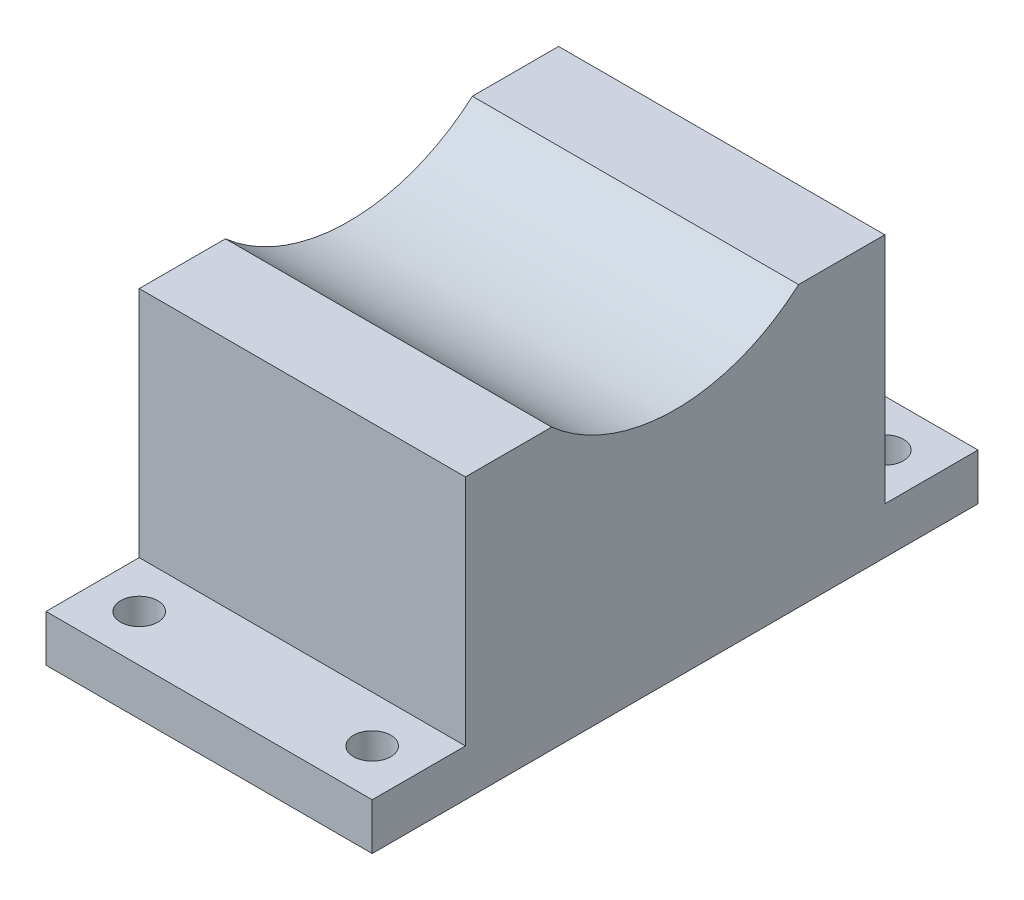
ISO-10303-21;
HEADER;
FILE_DESCRIPTION(('STEP AP214'),'2;1');
FILE_NAME('part.step','',(''),(''),'','','');
FILE_SCHEMA(('AUTOMOTIVE_DESIGN { 1 0 10303 214 1 1 1 1 }'));
ENDSEC;
DATA;
#1=APPLICATION_CONTEXT('core data for automotive mechanical design processes');
#2=APPLICATION_PROTOCOL_DEFINITION('international standard','automotive_design',2000,#1);
#3=PRODUCT_CONTEXT('',#1,'mechanical');
#4=PRODUCT('Part','Part','',(#3));
#5=PRODUCT_RELATED_PRODUCT_CATEGORY('part','',(#4));
#6=PRODUCT_DEFINITION_FORMATION('','',#4);
#7=PRODUCT_DEFINITION_CONTEXT('part definition',#1,'design');
#8=PRODUCT_DEFINITION('design','',#6,#7);
#9=PRODUCT_DEFINITION_SHAPE('','',#8);
#10=(LENGTH_UNIT() NAMED_UNIT(*) SI_UNIT(.MILLI.,.METRE.));
#11=(NAMED_UNIT(*) PLANE_ANGLE_UNIT() SI_UNIT($,.RADIAN.));
#12=(NAMED_UNIT(*) SI_UNIT($,.STERADIAN.) SOLID_ANGLE_UNIT());
#13=UNCERTAINTY_MEASURE_WITH_UNIT(LENGTH_MEASURE(1.E-05),#10,'distance_accuracy_value','');
#14=(GEOMETRIC_REPRESENTATION_CONTEXT(3) GLOBAL_UNCERTAINTY_ASSIGNED_CONTEXT((#13)) GLOBAL_UNIT_ASSIGNED_CONTEXT((#10,
#11,#12)) REPRESENTATION_CONTEXT('',''));
#15=CARTESIAN_POINT('',(0.,0.,0.));
#16=DIRECTION('',(0.,0.,1.));
#17=DIRECTION('',(1.,0.,0.));
#18=AXIS2_PLACEMENT_3D('',#15,#16,#17);
#19=CARTESIAN_POINT('',(35.,5.09934585254934,-1.30802110345688));
#20=DIRECTION('',(0.,1.,0.));
#21=DIRECTION('',(0.,0.,1.));
#22=AXIS2_PLACEMENT_3D('',#19,#20,#21);
#23=PLANE('',#22);
#24=DIRECTION('',(0.,0.,-1.));
#25=VECTOR('',#24,1.);
#26=CARTESIAN_POINT('',(0.,5.09934585254934,-1.30802110345688));
#27=LINE('',#26,#25);
#28=CARTESIAN_POINT('',(0.,5.09934585254934,-1.30802110345688));
#29=VERTEX_POINT('',#28);
#30=CARTESIAN_POINT('',(0.,5.09934585254934,-10.5607115959362));
#31=VERTEX_POINT('',#30);
#32=EDGE_CURVE('E145',#29,#31,#27,.T.);
#33=ORIENTED_EDGE('',*,*,#32,.F.);
#34=DIRECTION('',(-1.,0.,0.));
#35=VECTOR('',#34,1.);
#36=CARTESIAN_POINT('',(35.,5.09934585254934,-1.30802110345688));
#37=LINE('',#36,#35);
#38=CARTESIAN_POINT('',(35.,5.09934585254934,-1.30802110345688));
#39=VERTEX_POINT('',#38);
#40=EDGE_CURVE('E11',#39,#29,#37,.T.);
#41=ORIENTED_EDGE('',*,*,#40,.F.);
#42=DIRECTION('',(0.,0.,-1.));
#43=VECTOR('',#42,1.);
#44=CARTESIAN_POINT('',(35.,5.09934585254934,-1.30802110345688));
#45=LINE('',#44,#43);
#46=CARTESIAN_POINT('',(35.,5.09934585254934,-10.5607115959362));
#47=VERTEX_POINT('',#46);
#48=EDGE_CURVE('E169',#39,#47,#45,.T.);
#49=ORIENTED_EDGE('',*,*,#48,.T.);
#50=DIRECTION('',(-1.,0.,0.));
#51=VECTOR('',#50,1.);
#52=CARTESIAN_POINT('',(35.,5.09934585254934,-10.5607115959362));
#53=LINE('',#52,#51);
#54=EDGE_CURVE('E97',#47,#31,#53,.T.);
#55=ORIENTED_EDGE('',*,*,#54,.T.);
#56=EDGE_LOOP('',(#33,#41,#49,#55));
#57=FACE_BOUND('',#56,.T.);
#58=ADVANCED_FACE('F35',(#57),#23,.T.);
#59=CARTESIAN_POINT('',(35.,5.09934585254934,-1.30802110345688));
#60=DIRECTION('',(0.,0.,-1.));
#61=DIRECTION('',(0.,1.,0.));
#62=AXIS2_PLACEMENT_3D('',#59,#60,#61);
#63=PLANE('',#62);
#64=DIRECTION('',(0.,-1.,0.));
#65=VECTOR('',#64,1.);
#66=CARTESIAN_POINT('',(0.,5.09934585254934,-1.30802110345688));
#67=LINE('',#66,#65);
#68=CARTESIAN_POINT('',(0.,-19.9006541474507,-1.30802110345689));
#69=VERTEX_POINT('',#68);
#70=EDGE_CURVE('E168',#29,#69,#67,.T.);
#71=ORIENTED_EDGE('',*,*,#70,.T.);
#72=DIRECTION('',(-1.,0.,0.));
#73=VECTOR('',#72,1.);
#74=CARTESIAN_POINT('',(35.,-19.9006541474507,-1.30802110345689));
#75=LINE('',#74,#73);
#76=CARTESIAN_POINT('',(35.,-19.9006541474507,-1.30802110345689));
#77=VERTEX_POINT('',#76);
#78=EDGE_CURVE('E44',#77,#69,#75,.T.);
#79=ORIENTED_EDGE('',*,*,#78,.F.);
#80=DIRECTION('',(0.,-1.,0.));
#81=VECTOR('',#80,1.);
#82=CARTESIAN_POINT('',(35.,5.09934585254934,-1.30802110345688));
#83=LINE('',#82,#81);
#84=EDGE_CURVE('E134',#39,#77,#83,.T.);
#85=ORIENTED_EDGE('',*,*,#84,.F.);
#86=ORIENTED_EDGE('',*,*,#40,.T.);
#87=EDGE_LOOP('',(#71,#79,#85,#86));
#88=FACE_BOUND('',#87,.T.);
#89=ADVANCED_FACE('F238',(#88),#63,.F.);
#90=CARTESIAN_POINT('',(35.,-19.9006541474507,8.69197889654312));
#91=DIRECTION('',(0.,1.,0.));
#92=DIRECTION('',(0.,0.,1.));
#93=AXIS2_PLACEMENT_3D('',#90,#91,#92);
#94=PLANE('',#93);
#95=CARTESIAN_POINT('',(5.,-19.9006541474507,3.69197889654312));
#96=DIRECTION('',(0.,1.,0.));
#97=DIRECTION('',(0.,0.,1.));
#98=AXIS2_PLACEMENT_3D('',#95,#96,#97);
#99=CIRCLE('',#98,2.);
#100=CARTESIAN_POINT('',(5.,-19.9006541474507,5.69197889654312));
#101=VERTEX_POINT('',#100);
#102=EDGE_CURVE('E149',#101,#101,#99,.T.);
#103=ORIENTED_EDGE('',*,*,#102,.F.);
#104=EDGE_LOOP('',(#103));
#105=FACE_BOUND('',#104,.T.);
#106=CARTESIAN_POINT('',(30.,-19.9006541474507,3.69197889654312));
#107=DIRECTION('',(0.,1.,0.));
#108=DIRECTION('',(0.,0.,1.));
#109=AXIS2_PLACEMENT_3D('',#106,#107,#108);
#110=CIRCLE('',#109,2.);
#111=CARTESIAN_POINT('',(30.,-19.9006541474507,5.69197889654312));
#112=VERTEX_POINT('',#111);
#113=EDGE_CURVE('E191',#112,#112,#110,.T.);
#114=ORIENTED_EDGE('',*,*,#113,.F.);
#115=EDGE_LOOP('',(#114));
#116=FACE_BOUND('',#115,.T.);
#117=DIRECTION('',(0.,0.,-1.));
#118=VECTOR('',#117,1.);
#119=CARTESIAN_POINT('',(0.,-19.9006541474507,8.69197889654312));
#120=LINE('',#119,#118);
#121=CARTESIAN_POINT('',(0.,-19.9006541474507,8.69197889654312));
#122=VERTEX_POINT('',#121);
#123=EDGE_CURVE('E122',#122,#69,#120,.T.);
#124=ORIENTED_EDGE('',*,*,#123,.F.);
#125=DIRECTION('',(-1.,0.,0.));
#126=VECTOR('',#125,1.);
#127=CARTESIAN_POINT('',(35.,-19.9006541474507,8.69197889654312));
#128=LINE('',#127,#126);
#129=CARTESIAN_POINT('',(35.,-19.9006541474507,8.69197889654312));
#130=VERTEX_POINT('',#129);
#131=EDGE_CURVE('E117',#130,#122,#128,.T.);
#132=ORIENTED_EDGE('',*,*,#131,.F.);
#133=DIRECTION('',(0.,0.,-1.));
#134=VECTOR('',#133,1.);
#135=CARTESIAN_POINT('',(35.,-19.9006541474507,8.69197889654312));
#136=LINE('',#135,#134);
#137=EDGE_CURVE('E120',#130,#77,#136,.T.);
#138=ORIENTED_EDGE('',*,*,#137,.T.);
#139=ORIENTED_EDGE('',*,*,#78,.T.);
#140=EDGE_LOOP('',(#124,#132,#138,#139));
#141=FACE_BOUND('',#140,.T.);
#142=ADVANCED_FACE('F119',(#105,#116,#141),#94,.T.);
#143=CARTESIAN_POINT('',(35.,-24.9006541474507,8.69197889654312));
#144=DIRECTION('',(0.,0.,1.));
#145=DIRECTION('',(1.,0.,0.));
#146=AXIS2_PLACEMENT_3D('',#143,#144,#145);
#147=PLANE('',#146);
#148=DIRECTION('',(0.,1.,0.));
#149=VECTOR('',#148,1.);
#150=CARTESIAN_POINT('',(0.,-24.9006541474507,8.69197889654312));
#151=LINE('',#150,#149);
#152=CARTESIAN_POINT('',(0.,-24.9006541474507,8.69197889654312));
#153=VERTEX_POINT('',#152);
#154=EDGE_CURVE('E165',#153,#122,#151,.T.);
#155=ORIENTED_EDGE('',*,*,#154,.F.);
#156=DIRECTION('',(-1.,0.,0.));
#157=VECTOR('',#156,1.);
#158=CARTESIAN_POINT('',(35.,-24.9006541474507,8.69197889654312));
#159=LINE('',#158,#157);
#160=CARTESIAN_POINT('',(35.,-24.9006541474507,8.69197889654312));
#161=VERTEX_POINT('',#160);
#162=EDGE_CURVE('E127',#161,#153,#159,.T.);
#163=ORIENTED_EDGE('',*,*,#162,.F.);
#164=DIRECTION('',(0.,1.,0.));
#165=VECTOR('',#164,1.);
#166=CARTESIAN_POINT('',(35.,-24.9006541474507,8.69197889654312));
#167=LINE('',#166,#165);
#168=EDGE_CURVE('E133',#161,#130,#167,.T.);
#169=ORIENTED_EDGE('',*,*,#168,.T.);
#170=ORIENTED_EDGE('',*,*,#131,.T.);
#171=EDGE_LOOP('',(#155,#163,#169,#170));
#172=FACE_BOUND('',#171,.T.);
#173=ADVANCED_FACE('F136',(#172),#147,.T.);
#174=CARTESIAN_POINT('',(35.,-24.9006541474507,8.69197889654312));
#175=DIRECTION('',(0.,1.,0.));
#176=DIRECTION('',(0.,0.,1.));
#177=AXIS2_PLACEMENT_3D('',#174,#175,#176);
#178=PLANE('',#177);
#179=CARTESIAN_POINT('',(5.,-24.9006541474507,3.69197889654312));
#180=DIRECTION('',(0.,-1.,0.));
#181=DIRECTION('',(0.,0.,-1.));
#182=AXIS2_PLACEMENT_3D('',#179,#180,#181);
#183=CIRCLE('',#182,2.);
#184=CARTESIAN_POINT('',(5.,-24.9006541474507,1.69197889654312));
#185=VERTEX_POINT('',#184);
#186=EDGE_CURVE('E193',#185,#185,#183,.T.);
#187=ORIENTED_EDGE('',*,*,#186,.F.);
#188=EDGE_LOOP('',(#187));
#189=FACE_BOUND('',#188,.T.);
#190=CARTESIAN_POINT('',(30.,-24.9006541474507,-51.3080211034569));
#191=DIRECTION('',(0.,-1.,0.));
#192=DIRECTION('',(0.,0.,-1.));
#193=AXIS2_PLACEMENT_3D('',#190,#191,#192);
#194=CIRCLE('',#193,2.);
#195=CARTESIAN_POINT('',(30.,-24.9006541474507,-53.3080211034569));
#196=VERTEX_POINT('',#195);
#197=EDGE_CURVE('E198',#196,#196,#194,.T.);
#198=ORIENTED_EDGE('',*,*,#197,.F.);
#199=EDGE_LOOP('',(#198));
#200=FACE_BOUND('',#199,.T.);
#201=CARTESIAN_POINT('',(5.,-24.9006541474507,-51.3080211034569));
#202=DIRECTION('',(0.,-1.,0.));
#203=DIRECTION('',(0.,0.,-1.));
#204=AXIS2_PLACEMENT_3D('',#201,#202,#203);
#205=CIRCLE('',#204,2.);
#206=CARTESIAN_POINT('',(5.,-24.9006541474507,-53.3080211034569));
#207=VERTEX_POINT('',#206);
#208=EDGE_CURVE('E292',#207,#207,#205,.T.);
#209=ORIENTED_EDGE('',*,*,#208,.F.);
#210=EDGE_LOOP('',(#209));
#211=FACE_BOUND('',#210,.T.);
#212=CARTESIAN_POINT('',(30.,-24.9006541474507,3.69197889654312));
#213=DIRECTION('',(0.,-1.,0.));
#214=DIRECTION('',(0.,0.,-1.));
#215=AXIS2_PLACEMENT_3D('',#212,#213,#214);
#216=CIRCLE('',#215,2.);
#217=CARTESIAN_POINT('',(30.,-24.9006541474507,1.69197889654312));
#218=VERTEX_POINT('',#217);
#219=EDGE_CURVE('E187',#218,#218,#216,.T.);
#220=ORIENTED_EDGE('',*,*,#219,.F.);
#221=EDGE_LOOP('',(#220));
#222=FACE_BOUND('',#221,.T.);
#223=DIRECTION('',(0.,0.,-1.));
#224=VECTOR('',#223,1.);
#225=CARTESIAN_POINT('',(0.,-24.9006541474507,8.69197889654312));
#226=LINE('',#225,#224);
#227=CARTESIAN_POINT('',(0.,-24.9006541474507,-56.3080211034569));
#228=VERTEX_POINT('',#227);
#229=EDGE_CURVE('E163',#153,#228,#226,.T.);
#230=ORIENTED_EDGE('',*,*,#229,.T.);
#231=DIRECTION('',(-1.,0.,0.));
#232=VECTOR('',#231,1.);
#233=CARTESIAN_POINT('',(35.,-24.9006541474507,-56.3080211034569));
#234=LINE('',#233,#232);
#235=CARTESIAN_POINT('',(35.,-24.9006541474507,-56.3080211034569));
#236=VERTEX_POINT('',#235);
#237=EDGE_CURVE('E173',#236,#228,#234,.T.);
#238=ORIENTED_EDGE('',*,*,#237,.F.);
#239=DIRECTION('',(0.,0.,-1.));
#240=VECTOR('',#239,1.);
#241=CARTESIAN_POINT('',(35.,-24.9006541474507,8.69197889654312));
#242=LINE('',#241,#240);
#243=EDGE_CURVE('E138',#161,#236,#242,.T.);
#244=ORIENTED_EDGE('',*,*,#243,.F.);
#245=ORIENTED_EDGE('',*,*,#162,.T.);
#246=EDGE_LOOP('',(#230,#238,#244,#245));
#247=FACE_BOUND('',#246,.T.);
#248=ADVANCED_FACE('F252',(#189,#200,#211,#222,#247),#178,.F.);
#249=CARTESIAN_POINT('',(35.,-24.9006541474507,-56.3080211034569));
#250=DIRECTION('',(0.,0.,1.));
#251=DIRECTION('',(1.,0.,0.));
#252=AXIS2_PLACEMENT_3D('',#249,#250,#251);
#253=PLANE('',#252);
#254=DIRECTION('',(0.,1.,0.));
#255=VECTOR('',#254,1.);
#256=CARTESIAN_POINT('',(0.,-24.9006541474507,-56.3080211034569));
#257=LINE('',#256,#255);
#258=CARTESIAN_POINT('',(0.,-19.9006541474507,-56.3080211034569));
#259=VERTEX_POINT('',#258);
#260=EDGE_CURVE('E161',#228,#259,#257,.T.);
#261=ORIENTED_EDGE('',*,*,#260,.T.);
#262=DIRECTION('',(-1.,0.,0.));
#263=VECTOR('',#262,1.);
#264=CARTESIAN_POINT('',(35.,-19.9006541474507,-56.3080211034569));
#265=LINE('',#264,#263);
#266=CARTESIAN_POINT('',(35.,-19.9006541474507,-56.3080211034569));
#267=VERTEX_POINT('',#266);
#268=EDGE_CURVE('E176',#267,#259,#265,.T.);
#269=ORIENTED_EDGE('',*,*,#268,.F.);
#270=DIRECTION('',(0.,1.,0.));
#271=VECTOR('',#270,1.);
#272=CARTESIAN_POINT('',(35.,-24.9006541474507,-56.3080211034569));
#273=LINE('',#272,#271);
#274=EDGE_CURVE('E140',#236,#267,#273,.T.);
#275=ORIENTED_EDGE('',*,*,#274,.F.);
#276=ORIENTED_EDGE('',*,*,#237,.T.);
#277=EDGE_LOOP('',(#261,#269,#275,#276));
#278=FACE_BOUND('',#277,.T.);
#279=ADVANCED_FACE('F223',(#278),#253,.F.);
#280=CARTESIAN_POINT('',(35.,-19.9006541474507,-56.3080211034569));
#281=DIRECTION('',(0.,-1.,0.));
#282=DIRECTION('',(0.,0.,-1.));
#283=AXIS2_PLACEMENT_3D('',#280,#281,#282);
#284=PLANE('',#283);
#285=CARTESIAN_POINT('',(30.,-19.9006541474507,-51.3080211034569));
#286=DIRECTION('',(0.,-1.,0.));
#287=DIRECTION('',(0.,0.,-1.));
#288=AXIS2_PLACEMENT_3D('',#285,#286,#287);
#289=CIRCLE('',#288,2.);
#290=CARTESIAN_POINT('',(30.,-19.9006541474507,-53.3080211034569));
#291=VERTEX_POINT('',#290);
#292=EDGE_CURVE('E38',#291,#291,#289,.T.);
#293=ORIENTED_EDGE('',*,*,#292,.T.);
#294=EDGE_LOOP('',(#293));
#295=FACE_BOUND('',#294,.T.);
#296=CARTESIAN_POINT('',(5.,-19.9006541474507,-51.3080211034569));
#297=DIRECTION('',(0.,-1.,0.));
#298=DIRECTION('',(0.,0.,-1.));
#299=AXIS2_PLACEMENT_3D('',#296,#297,#298);
#300=CIRCLE('',#299,2.);
#301=CARTESIAN_POINT('',(5.,-19.9006541474507,-53.3080211034569));
#302=VERTEX_POINT('',#301);
#303=EDGE_CURVE('E185',#302,#302,#300,.T.);
#304=ORIENTED_EDGE('',*,*,#303,.T.);
#305=EDGE_LOOP('',(#304));
#306=FACE_BOUND('',#305,.T.);
#307=DIRECTION('',(0.,0.,1.));
#308=VECTOR('',#307,1.);
#309=CARTESIAN_POINT('',(0.,-19.9006541474507,-56.3080211034569));
#310=LINE('',#309,#308);
#311=CARTESIAN_POINT('',(0.,-19.9006541474507,-46.3080211034569));
#312=VERTEX_POINT('',#311);
#313=EDGE_CURVE('E158',#259,#312,#310,.T.);
#314=ORIENTED_EDGE('',*,*,#313,.T.);
#315=DIRECTION('',(-1.,0.,0.));
#316=VECTOR('',#315,1.);
#317=CARTESIAN_POINT('',(35.,-19.9006541474507,-46.3080211034569));
#318=LINE('',#317,#316);
#319=CARTESIAN_POINT('',(35.,-19.9006541474507,-46.3080211034569));
#320=VERTEX_POINT('',#319);
#321=EDGE_CURVE('E179',#320,#312,#318,.T.);
#322=ORIENTED_EDGE('',*,*,#321,.F.);
#323=DIRECTION('',(0.,0.,1.));
#324=VECTOR('',#323,1.);
#325=CARTESIAN_POINT('',(35.,-19.9006541474507,-56.3080211034569));
#326=LINE('',#325,#324);
#327=EDGE_CURVE('E215',#267,#320,#326,.T.);
#328=ORIENTED_EDGE('',*,*,#327,.F.);
#329=ORIENTED_EDGE('',*,*,#268,.T.);
#330=EDGE_LOOP('',(#314,#322,#328,#329));
#331=FACE_BOUND('',#330,.T.);
#332=ADVANCED_FACE('F227',(#295,#306,#331),#284,.F.);
#333=CARTESIAN_POINT('',(35.,5.09934585254934,-46.3080211034569));
#334=DIRECTION('',(0.,0.,-1.));
#335=DIRECTION('',(-1.,0.,0.));
#336=AXIS2_PLACEMENT_3D('',#333,#334,#335);
#337=PLANE('',#336);
#338=DIRECTION('',(0.,-1.,0.));
#339=VECTOR('',#338,1.);
#340=CARTESIAN_POINT('',(0.,5.09934585254934,-46.3080211034569));
#341=LINE('',#340,#339);
#342=CARTESIAN_POINT('',(0.,5.09934585254934,-46.3080211034569));
#343=VERTEX_POINT('',#342);
#344=EDGE_CURVE('E155',#343,#312,#341,.T.);
#345=ORIENTED_EDGE('',*,*,#344,.F.);
#346=DIRECTION('',(-1.,0.,0.));
#347=VECTOR('',#346,1.);
#348=CARTESIAN_POINT('',(35.,5.09934585254934,-46.3080211034569));
#349=LINE('',#348,#347);
#350=CARTESIAN_POINT('',(35.,5.09934585254934,-46.3080211034569));
#351=VERTEX_POINT('',#350);
#352=EDGE_CURVE('E181',#351,#343,#349,.T.);
#353=ORIENTED_EDGE('',*,*,#352,.F.);
#354=DIRECTION('',(0.,-1.,0.));
#355=VECTOR('',#354,1.);
#356=CARTESIAN_POINT('',(35.,5.09934585254934,-46.3080211034569));
#357=LINE('',#356,#355);
#358=EDGE_CURVE('E212',#351,#320,#357,.T.);
#359=ORIENTED_EDGE('',*,*,#358,.T.);
#360=ORIENTED_EDGE('',*,*,#321,.T.);
#361=EDGE_LOOP('',(#345,#353,#359,#360));
#362=FACE_BOUND('',#361,.T.);
#363=ADVANCED_FACE('F230',(#362),#337,.T.);
#364=CARTESIAN_POINT('',(35.,5.09934585254934,-37.0553306109775));
#365=DIRECTION('',(0.,1.,0.));
#366=DIRECTION('',(0.,0.,1.));
#367=AXIS2_PLACEMENT_3D('',#364,#365,#366);
#368=PLANE('',#367);
#369=DIRECTION('',(0.,0.,-1.));
#370=VECTOR('',#369,1.);
#371=CARTESIAN_POINT('',(0.,5.09934585254934,-37.0553306109775));
#372=LINE('',#371,#370);
#373=CARTESIAN_POINT('',(0.,5.09934585254934,-37.0553306109775));
#374=VERTEX_POINT('',#373);
#375=EDGE_CURVE('E152',#374,#343,#372,.T.);
#376=ORIENTED_EDGE('',*,*,#375,.F.);
#377=DIRECTION('',(-1.,0.,0.));
#378=VECTOR('',#377,1.);
#379=CARTESIAN_POINT('',(35.,5.09934585254934,-37.0553306109775));
#380=LINE('',#379,#378);
#381=CARTESIAN_POINT('',(35.,5.09934585254934,-37.0553306109775));
#382=VERTEX_POINT('',#381);
#383=EDGE_CURVE('E183',#382,#374,#380,.T.);
#384=ORIENTED_EDGE('',*,*,#383,.F.);
#385=DIRECTION('',(0.,0.,-1.));
#386=VECTOR('',#385,1.);
#387=CARTESIAN_POINT('',(35.,5.09934585254934,-37.0553306109775));
#388=LINE('',#387,#386);
#389=EDGE_CURVE('E209',#382,#351,#388,.T.);
#390=ORIENTED_EDGE('',*,*,#389,.T.);
#391=ORIENTED_EDGE('',*,*,#352,.T.);
#392=EDGE_LOOP('',(#376,#384,#390,#391));
#393=FACE_BOUND('',#392,.T.);
#394=ADVANCED_FACE('F234',(#393),#368,.T.);
#395=CARTESIAN_POINT('',(35.,20.0993458525493,-23.8080211034569));
#396=DIRECTION('',(-1.,0.,0.));
#397=DIRECTION('',(0.,0.,1.));
#398=AXIS2_PLACEMENT_3D('',#395,#396,#397);
#399=CYLINDRICAL_SURFACE('',#398,20.0122764619133);
#400=CARTESIAN_POINT('',(0.,20.0993458525493,-23.8080211034569));
#401=DIRECTION('',(1.,0.,0.));
#402=DIRECTION('',(0.,0.,-1.));
#403=AXIS2_PLACEMENT_3D('',#400,#401,#402);
#404=CIRCLE('',#403,20.0122764619133);
#405=EDGE_CURVE('E148',#31,#374,#404,.T.);
#406=ORIENTED_EDGE('',*,*,#405,.F.);
#407=ORIENTED_EDGE('',*,*,#54,.F.);
#408=CARTESIAN_POINT('',(35.,20.0993458525493,-23.8080211034569));
#409=DIRECTION('',(1.,0.,0.));
#410=DIRECTION('',(0.,0.,-1.));
#411=AXIS2_PLACEMENT_3D('',#408,#409,#410);
#412=CIRCLE('',#411,20.0122764619133);
#413=EDGE_CURVE('E207',#47,#382,#412,.T.);
#414=ORIENTED_EDGE('',*,*,#413,.T.);
#415=ORIENTED_EDGE('',*,*,#383,.T.);
#416=EDGE_LOOP('',(#406,#407,#414,#415));
#417=FACE_BOUND('',#416,.T.);
#418=ADVANCED_FACE('F235',(#417),#399,.F.);
#419=CARTESIAN_POINT('',(35.,20.0993458525493,-23.8080211034569));
#420=DIRECTION('',(1.,0.,0.));
#421=DIRECTION('',(0.,0.,-1.));
#422=AXIS2_PLACEMENT_3D('',#419,#420,#421);
#423=PLANE('',#422);
#424=ORIENTED_EDGE('',*,*,#48,.F.);
#425=ORIENTED_EDGE('',*,*,#84,.T.);
#426=ORIENTED_EDGE('',*,*,#137,.F.);
#427=ORIENTED_EDGE('',*,*,#168,.F.);
#428=ORIENTED_EDGE('',*,*,#243,.T.);
#429=ORIENTED_EDGE('',*,*,#274,.T.);
#430=ORIENTED_EDGE('',*,*,#327,.T.);
#431=ORIENTED_EDGE('',*,*,#358,.F.);
#432=ORIENTED_EDGE('',*,*,#389,.F.);
#433=ORIENTED_EDGE('',*,*,#413,.F.);
#434=EDGE_LOOP('',(#424,#425,#426,#427,#428,#429,#430,#431,#432,#433));
#435=FACE_BOUND('',#434,.T.);
#436=ADVANCED_FACE('F132',(#435),#423,.T.);
#437=CARTESIAN_POINT('',(0.,20.0993458525493,-23.8080211034569));
#438=DIRECTION('',(1.,0.,0.));
#439=DIRECTION('',(0.,0.,-1.));
#440=AXIS2_PLACEMENT_3D('',#437,#438,#439);
#441=PLANE('',#440);
#442=ORIENTED_EDGE('',*,*,#32,.T.);
#443=ORIENTED_EDGE('',*,*,#405,.T.);
#444=ORIENTED_EDGE('',*,*,#375,.T.);
#445=ORIENTED_EDGE('',*,*,#344,.T.);
#446=ORIENTED_EDGE('',*,*,#313,.F.);
#447=ORIENTED_EDGE('',*,*,#260,.F.);
#448=ORIENTED_EDGE('',*,*,#229,.F.);
#449=ORIENTED_EDGE('',*,*,#154,.T.);
#450=ORIENTED_EDGE('',*,*,#123,.T.);
#451=ORIENTED_EDGE('',*,*,#70,.F.);
#452=EDGE_LOOP('',(#442,#443,#444,#445,#446,#447,#448,#449,#450,#451));
#453=FACE_BOUND('',#452,.T.);
#454=ADVANCED_FACE('F237',(#453),#441,.F.);
#455=CARTESIAN_POINT('',(5.,-14.9006541474507,-51.3080211034569));
#456=DIRECTION('',(0.,-1.,0.));
#457=DIRECTION('',(0.,0.,-1.));
#458=AXIS2_PLACEMENT_3D('',#455,#456,#457);
#459=CYLINDRICAL_SURFACE('',#458,2.);
#460=ORIENTED_EDGE('',*,*,#208,.T.);
#461=EDGE_LOOP('',(#460));
#462=FACE_BOUND('',#461,.T.);
#463=ORIENTED_EDGE('',*,*,#303,.F.);
#464=EDGE_LOOP('',(#463));
#465=FACE_BOUND('',#464,.T.);
#466=ADVANCED_FACE('F271',(#462,#465),#459,.F.);
#467=CARTESIAN_POINT('',(30.,-14.9006541474507,-51.3080211034569));
#468=DIRECTION('',(0.,-1.,0.));
#469=DIRECTION('',(0.,0.,-1.));
#470=AXIS2_PLACEMENT_3D('',#467,#468,#469);
#471=CYLINDRICAL_SURFACE('',#470,2.);
#472=ORIENTED_EDGE('',*,*,#197,.T.);
#473=EDGE_LOOP('',(#472));
#474=FACE_BOUND('',#473,.T.);
#475=ORIENTED_EDGE('',*,*,#292,.F.);
#476=EDGE_LOOP('',(#475));
#477=FACE_BOUND('',#476,.T.);
#478=ADVANCED_FACE('F277',(#474,#477),#471,.F.);
#479=CARTESIAN_POINT('',(30.,-14.9006541474507,3.69197889654312));
#480=DIRECTION('',(0.,-1.,0.));
#481=DIRECTION('',(0.,0.,-1.));
#482=AXIS2_PLACEMENT_3D('',#479,#480,#481);
#483=CYLINDRICAL_SURFACE('',#482,2.);
#484=ORIENTED_EDGE('',*,*,#113,.T.);
#485=EDGE_LOOP('',(#484));
#486=FACE_BOUND('',#485,.T.);
#487=ORIENTED_EDGE('',*,*,#219,.T.);
#488=EDGE_LOOP('',(#487));
#489=FACE_BOUND('',#488,.T.);
#490=ADVANCED_FACE('F273',(#486,#489),#483,.F.);
#491=CARTESIAN_POINT('',(5.,-14.9006541474507,3.69197889654312));
#492=DIRECTION('',(0.,-1.,0.));
#493=DIRECTION('',(0.,0.,-1.));
#494=AXIS2_PLACEMENT_3D('',#491,#492,#493);
#495=CYLINDRICAL_SURFACE('',#494,2.);
#496=ORIENTED_EDGE('',*,*,#102,.T.);
#497=EDGE_LOOP('',(#496));
#498=FACE_BOUND('',#497,.T.);
#499=ORIENTED_EDGE('',*,*,#186,.T.);
#500=EDGE_LOOP('',(#499));
#501=FACE_BOUND('',#500,.T.);
#502=ADVANCED_FACE('F276',(#498,#501),#495,.F.);
#503=CLOSED_SHELL('',(#58,#89,#142,#173,#248,#279,#332,#363,#394,#418,#436,#454,#466,#478,#490,#502));
#504=MANIFOLD_SOLID_BREP('B2',#503);
#505=ADVANCED_BREP_SHAPE_REPRESENTATION('',(#18,#504),#14);
#506=SHAPE_DEFINITION_REPRESENTATION(#9,#505);
ENDSEC;
END-ISO-10303-21;
